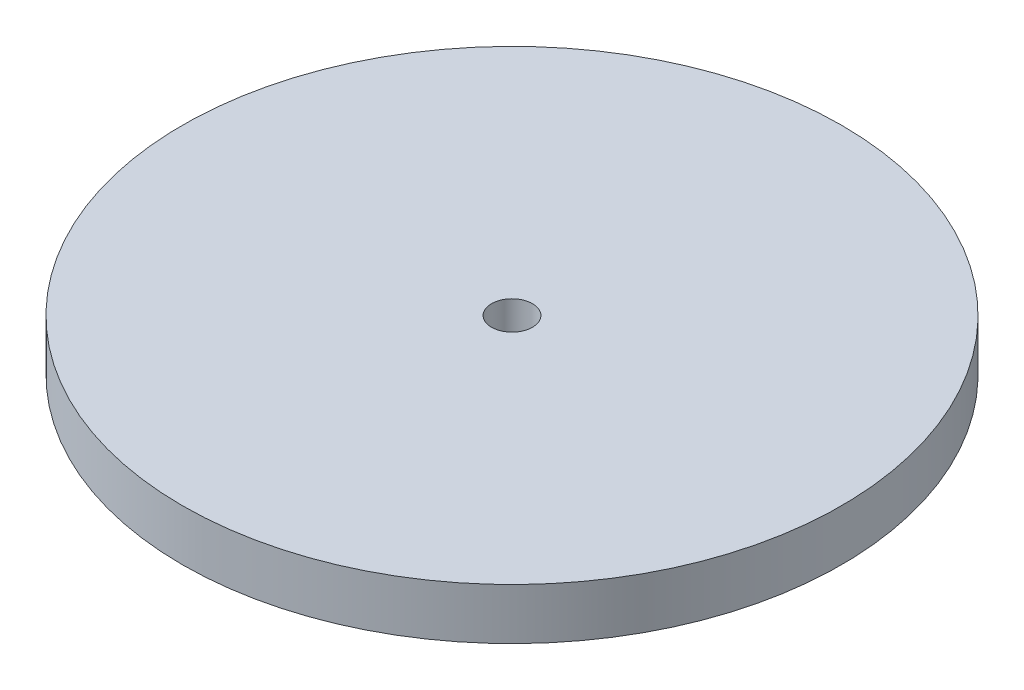
ISO-10303-21;
HEADER;
FILE_DESCRIPTION(('STEP AP214'),'2;1');
FILE_NAME('part.step','',(''),(''),'','','');
FILE_SCHEMA(('AUTOMOTIVE_DESIGN { 1 0 10303 214 1 1 1 1 }'));
ENDSEC;
DATA;
#1=APPLICATION_CONTEXT('core data for automotive mechanical design processes');
#2=APPLICATION_PROTOCOL_DEFINITION('international standard','automotive_design',2000,#1);
#3=PRODUCT_CONTEXT('',#1,'mechanical');
#4=PRODUCT('Part','Part','',(#3));
#5=PRODUCT_RELATED_PRODUCT_CATEGORY('part','',(#4));
#6=PRODUCT_DEFINITION_FORMATION('','',#4);
#7=PRODUCT_DEFINITION_CONTEXT('part definition',#1,'design');
#8=PRODUCT_DEFINITION('design','',#6,#7);
#9=PRODUCT_DEFINITION_SHAPE('','',#8);
#10=(LENGTH_UNIT() NAMED_UNIT(*) SI_UNIT(.MILLI.,.METRE.));
#11=(NAMED_UNIT(*) PLANE_ANGLE_UNIT() SI_UNIT($,.RADIAN.));
#12=(NAMED_UNIT(*) SI_UNIT($,.STERADIAN.) SOLID_ANGLE_UNIT());
#13=UNCERTAINTY_MEASURE_WITH_UNIT(LENGTH_MEASURE(1.E-05),#10,'distance_accuracy_value','');
#14=(GEOMETRIC_REPRESENTATION_CONTEXT(3) GLOBAL_UNCERTAINTY_ASSIGNED_CONTEXT((#13)) GLOBAL_UNIT_ASSIGNED_CONTEXT((#10,
#11,#12)) REPRESENTATION_CONTEXT('',''));
#15=CARTESIAN_POINT('',(0.,0.,0.));
#16=DIRECTION('',(0.,0.,1.));
#17=DIRECTION('',(1.,0.,0.));
#18=AXIS2_PLACEMENT_3D('',#15,#16,#17);
#19=CARTESIAN_POINT('',(0.,5.,0.));
#20=DIRECTION('',(0.,1.,0.));
#21=DIRECTION('',(0.,0.,1.));
#22=AXIS2_PLACEMENT_3D('',#19,#20,#21);
#23=PLANE('',#22);
#24=CARTESIAN_POINT('',(0.,5.,0.));
#25=DIRECTION('',(0.,1.,0.));
#26=DIRECTION('',(0.,0.,1.));
#27=AXIS2_PLACEMENT_3D('',#24,#25,#26);
#28=CIRCLE('',#27,32.2);
#29=CARTESIAN_POINT('',(0.,5.,32.2));
#30=VERTEX_POINT('',#29);
#31=EDGE_CURVE('E10',#30,#30,#28,.T.);
#32=ORIENTED_EDGE('',*,*,#31,.T.);
#33=EDGE_LOOP('',(#32));
#34=FACE_BOUND('',#33,.T.);
#35=CARTESIAN_POINT('',(0.,5.,0.));
#36=DIRECTION('',(0.,1.,0.));
#37=DIRECTION('',(0.,0.,1.));
#38=AXIS2_PLACEMENT_3D('',#35,#36,#37);
#39=CIRCLE('',#38,2.);
#40=CARTESIAN_POINT('',(0.,5.,2.));
#41=VERTEX_POINT('',#40);
#42=EDGE_CURVE('E42',#41,#41,#39,.T.);
#43=ORIENTED_EDGE('',*,*,#42,.F.);
#44=EDGE_LOOP('',(#43));
#45=FACE_BOUND('',#44,.T.);
#46=ADVANCED_FACE('F31',(#34,#45),#23,.T.);
#47=CARTESIAN_POINT('',(0.,0.,0.));
#48=DIRECTION('',(0.,1.,0.));
#49=DIRECTION('',(0.,0.,1.));
#50=AXIS2_PLACEMENT_3D('',#47,#48,#49);
#51=PLANE('',#50);
#52=CARTESIAN_POINT('',(0.,0.,0.));
#53=DIRECTION('',(0.,1.,0.));
#54=DIRECTION('',(0.,0.,1.));
#55=AXIS2_PLACEMENT_3D('',#52,#53,#54);
#56=CIRCLE('',#55,32.2);
#57=CARTESIAN_POINT('',(0.,0.,32.2));
#58=VERTEX_POINT('',#57);
#59=EDGE_CURVE('E35',#58,#58,#56,.T.);
#60=ORIENTED_EDGE('',*,*,#59,.F.);
#61=EDGE_LOOP('',(#60));
#62=FACE_BOUND('',#61,.T.);
#63=CARTESIAN_POINT('',(0.,0.,0.));
#64=DIRECTION('',(0.,1.,0.));
#65=DIRECTION('',(0.,0.,1.));
#66=AXIS2_PLACEMENT_3D('',#63,#64,#65);
#67=CIRCLE('',#66,2.);
#68=CARTESIAN_POINT('',(0.,0.,2.));
#69=VERTEX_POINT('',#68);
#70=EDGE_CURVE('E44',#69,#69,#67,.T.);
#71=ORIENTED_EDGE('',*,*,#70,.T.);
#72=EDGE_LOOP('',(#71));
#73=FACE_BOUND('',#72,.T.);
#74=ADVANCED_FACE('F54',(#62,#73),#51,.F.);
#75=CARTESIAN_POINT('',(0.,5.,0.));
#76=DIRECTION('',(0.,-1.,0.));
#77=DIRECTION('',(0.,0.,-1.));
#78=AXIS2_PLACEMENT_3D('',#75,#76,#77);
#79=CYLINDRICAL_SURFACE('',#78,32.2);
#80=ORIENTED_EDGE('',*,*,#31,.F.);
#81=EDGE_LOOP('',(#80));
#82=FACE_BOUND('',#81,.T.);
#83=ORIENTED_EDGE('',*,*,#59,.T.);
#84=EDGE_LOOP('',(#83));
#85=FACE_BOUND('',#84,.T.);
#86=ADVANCED_FACE('F33',(#82,#85),#79,.T.);
#87=CARTESIAN_POINT('',(0.,5.,0.));
#88=DIRECTION('',(0.,-1.,0.));
#89=DIRECTION('',(0.,0.,-1.));
#90=AXIS2_PLACEMENT_3D('',#87,#88,#89);
#91=CYLINDRICAL_SURFACE('',#90,2.);
#92=ORIENTED_EDGE('',*,*,#42,.T.);
#93=EDGE_LOOP('',(#92));
#94=FACE_BOUND('',#93,.T.);
#95=ORIENTED_EDGE('',*,*,#70,.F.);
#96=EDGE_LOOP('',(#95));
#97=FACE_BOUND('',#96,.T.);
#98=ADVANCED_FACE('F50',(#94,#97),#91,.F.);
#99=CLOSED_SHELL('',(#46,#74,#86,#98));
#100=MANIFOLD_SOLID_BREP('B2',#99);
#101=ADVANCED_BREP_SHAPE_REPRESENTATION('',(#18,#100),#14);
#102=SHAPE_DEFINITION_REPRESENTATION(#9,#101);
ENDSEC;
END-ISO-10303-21;
